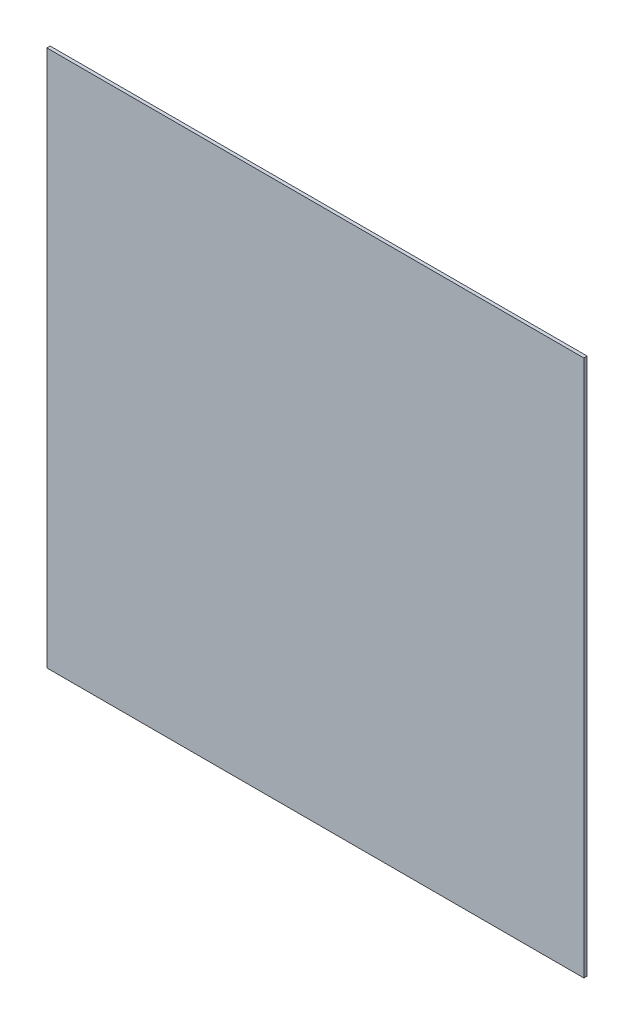
ISO-10303-21;
HEADER;
FILE_DESCRIPTION(('STEP AP214'),'2;1');
FILE_NAME('part.step','',(''),(''),'','','');
FILE_SCHEMA(('AUTOMOTIVE_DESIGN { 1 0 10303 214 1 1 1 1 }'));
ENDSEC;
DATA;
#1=APPLICATION_CONTEXT('core data for automotive mechanical design processes');
#2=APPLICATION_PROTOCOL_DEFINITION('international standard','automotive_design',2000,#1);
#3=PRODUCT_CONTEXT('',#1,'mechanical');
#4=PRODUCT('Part','Part','',(#3));
#5=PRODUCT_RELATED_PRODUCT_CATEGORY('part','',(#4));
#6=PRODUCT_DEFINITION_FORMATION('','',#4);
#7=PRODUCT_DEFINITION_CONTEXT('part definition',#1,'design');
#8=PRODUCT_DEFINITION('design','',#6,#7);
#9=PRODUCT_DEFINITION_SHAPE('','',#8);
#10=(LENGTH_UNIT() NAMED_UNIT(*) SI_UNIT(.MILLI.,.METRE.));
#11=(NAMED_UNIT(*) PLANE_ANGLE_UNIT() SI_UNIT($,.RADIAN.));
#12=(NAMED_UNIT(*) SI_UNIT($,.STERADIAN.) SOLID_ANGLE_UNIT());
#13=UNCERTAINTY_MEASURE_WITH_UNIT(LENGTH_MEASURE(1.E-05),#10,'distance_accuracy_value','');
#14=(GEOMETRIC_REPRESENTATION_CONTEXT(3) GLOBAL_UNCERTAINTY_ASSIGNED_CONTEXT((#13)) GLOBAL_UNIT_ASSIGNED_CONTEXT((#10,
#11,#12)) REPRESENTATION_CONTEXT('',''));
#15=CARTESIAN_POINT('',(0.,0.,0.));
#16=DIRECTION('',(0.,0.,1.));
#17=DIRECTION('',(1.,0.,0.));
#18=AXIS2_PLACEMENT_3D('',#15,#16,#17);
#19=CARTESIAN_POINT('',(50.,6.,0.07366));
#20=DIRECTION('',(1.,0.,0.));
#21=DIRECTION('',(0.,0.,-1.));
#22=AXIS2_PLACEMENT_3D('',#19,#20,#21);
#23=PLANE('',#22);
#24=DIRECTION('',(0.,-1.,0.));
#25=VECTOR('',#24,1.);
#26=CARTESIAN_POINT('',(50.,6.,0.));
#27=LINE('',#26,#25);
#28=CARTESIAN_POINT('',(50.,6.,0.));
#29=VERTEX_POINT('',#28);
#30=CARTESIAN_POINT('',(50.,-6.,0.));
#31=VERTEX_POINT('',#30);
#32=EDGE_CURVE('E114',#29,#31,#27,.T.);
#33=ORIENTED_EDGE('',*,*,#32,.T.);
#34=DIRECTION('',(0.,0.,-1.));
#35=VECTOR('',#34,1.);
#36=CARTESIAN_POINT('',(50.,-6.,0.07366));
#37=LINE('',#36,#35);
#38=CARTESIAN_POINT('',(50.,-6.,0.07366));
#39=VERTEX_POINT('',#38);
#40=EDGE_CURVE('E11',#39,#31,#37,.T.);
#41=ORIENTED_EDGE('',*,*,#40,.F.);
#42=DIRECTION('',(0.,-1.,0.));
#43=VECTOR('',#42,1.);
#44=CARTESIAN_POINT('',(50.,6.,0.07366));
#45=LINE('',#44,#43);
#46=CARTESIAN_POINT('',(50.,6.,0.07366));
#47=VERTEX_POINT('',#46);
#48=EDGE_CURVE('E97',#47,#39,#45,.T.);
#49=ORIENTED_EDGE('',*,*,#48,.F.);
#50=DIRECTION('',(0.,0.,-1.));
#51=VECTOR('',#50,1.);
#52=CARTESIAN_POINT('',(50.,6.,0.07366));
#53=LINE('',#52,#51);
#54=EDGE_CURVE('E110',#47,#29,#53,.T.);
#55=ORIENTED_EDGE('',*,*,#54,.T.);
#56=EDGE_LOOP('',(#33,#41,#49,#55));
#57=FACE_BOUND('',#56,.T.);
#58=ADVANCED_FACE('F45',(#57),#23,.F.);
#59=CARTESIAN_POINT('',(50.,-6.,0.07366));
#60=DIRECTION('',(0.,1.,0.));
#61=DIRECTION('',(0.,0.,1.));
#62=AXIS2_PLACEMENT_3D('',#59,#60,#61);
#63=PLANE('',#62);
#64=DIRECTION('',(1.,0.,0.));
#65=VECTOR('',#64,1.);
#66=CARTESIAN_POINT('',(50.,-6.,0.));
#67=LINE('',#66,#65);
#68=CARTESIAN_POINT('',(62.,-6.,0.));
#69=VERTEX_POINT('',#68);
#70=EDGE_CURVE('E102',#31,#69,#67,.T.);
#71=ORIENTED_EDGE('',*,*,#70,.T.);
#72=DIRECTION('',(0.,0.,-1.));
#73=VECTOR('',#72,1.);
#74=CARTESIAN_POINT('',(62.,-6.,0.07366));
#75=LINE('',#74,#73);
#76=CARTESIAN_POINT('',(62.,-6.,0.07366));
#77=VERTEX_POINT('',#76);
#78=EDGE_CURVE('E54',#77,#69,#75,.T.);
#79=ORIENTED_EDGE('',*,*,#78,.F.);
#80=DIRECTION('',(1.,0.,0.));
#81=VECTOR('',#80,1.);
#82=CARTESIAN_POINT('',(50.,-6.,0.07366));
#83=LINE('',#82,#81);
#84=EDGE_CURVE('E92',#39,#77,#83,.T.);
#85=ORIENTED_EDGE('',*,*,#84,.F.);
#86=ORIENTED_EDGE('',*,*,#40,.T.);
#87=EDGE_LOOP('',(#71,#79,#85,#86));
#88=FACE_BOUND('',#87,.T.);
#89=ADVANCED_FACE('F101',(#88),#63,.F.);
#90=CARTESIAN_POINT('',(62.,6.,0.07366));
#91=DIRECTION('',(-1.,0.,0.));
#92=DIRECTION('',(0.,0.,1.));
#93=AXIS2_PLACEMENT_3D('',#90,#91,#92);
#94=PLANE('',#93);
#95=DIRECTION('',(0.,1.,0.));
#96=VECTOR('',#95,1.);
#97=CARTESIAN_POINT('',(62.,6.,0.));
#98=LINE('',#97,#96);
#99=CARTESIAN_POINT('',(62.,6.,0.));
#100=VERTEX_POINT('',#99);
#101=EDGE_CURVE('E79',#69,#100,#98,.T.);
#102=ORIENTED_EDGE('',*,*,#101,.T.);
#103=DIRECTION('',(0.,0.,-1.));
#104=VECTOR('',#103,1.);
#105=CARTESIAN_POINT('',(62.,6.,0.07366));
#106=LINE('',#105,#104);
#107=CARTESIAN_POINT('',(62.,6.,0.07366));
#108=VERTEX_POINT('',#107);
#109=EDGE_CURVE('E104',#108,#100,#106,.T.);
#110=ORIENTED_EDGE('',*,*,#109,.F.);
#111=DIRECTION('',(0.,1.,0.));
#112=VECTOR('',#111,1.);
#113=CARTESIAN_POINT('',(62.,6.,0.07366));
#114=LINE('',#113,#112);
#115=EDGE_CURVE('E95',#77,#108,#114,.T.);
#116=ORIENTED_EDGE('',*,*,#115,.F.);
#117=ORIENTED_EDGE('',*,*,#78,.T.);
#118=EDGE_LOOP('',(#102,#110,#116,#117));
#119=FACE_BOUND('',#118,.T.);
#120=ADVANCED_FACE('F105',(#119),#94,.F.);
#121=CARTESIAN_POINT('',(50.,6.,0.07366));
#122=DIRECTION('',(0.,-1.,0.));
#123=DIRECTION('',(0.,0.,-1.));
#124=AXIS2_PLACEMENT_3D('',#121,#122,#123);
#125=PLANE('',#124);
#126=DIRECTION('',(-1.,0.,0.));
#127=VECTOR('',#126,1.);
#128=CARTESIAN_POINT('',(50.,6.,0.));
#129=LINE('',#128,#127);
#130=EDGE_CURVE('E85',#100,#29,#129,.T.);
#131=ORIENTED_EDGE('',*,*,#130,.T.);
#132=ORIENTED_EDGE('',*,*,#54,.F.);
#133=DIRECTION('',(-1.,0.,0.));
#134=VECTOR('',#133,1.);
#135=CARTESIAN_POINT('',(50.,6.,0.07366));
#136=LINE('',#135,#134);
#137=EDGE_CURVE('E62',#108,#47,#136,.T.);
#138=ORIENTED_EDGE('',*,*,#137,.F.);
#139=ORIENTED_EDGE('',*,*,#109,.T.);
#140=EDGE_LOOP('',(#131,#132,#138,#139));
#141=FACE_BOUND('',#140,.T.);
#142=ADVANCED_FACE('F128',(#141),#125,.F.);
#143=CARTESIAN_POINT('',(0.,0.,0.07366));
#144=DIRECTION('',(0.,0.,1.));
#145=DIRECTION('',(1.,0.,0.));
#146=AXIS2_PLACEMENT_3D('',#143,#144,#145);
#147=PLANE('',#146);
#148=ORIENTED_EDGE('',*,*,#48,.T.);
#149=ORIENTED_EDGE('',*,*,#84,.T.);
#150=ORIENTED_EDGE('',*,*,#115,.T.);
#151=ORIENTED_EDGE('',*,*,#137,.T.);
#152=EDGE_LOOP('',(#148,#149,#150,#151));
#153=FACE_BOUND('',#152,.T.);
#154=ADVANCED_FACE('F93',(#153),#147,.T.);
#155=CARTESIAN_POINT('',(0.,0.,0.));
#156=DIRECTION('',(0.,0.,1.));
#157=DIRECTION('',(1.,0.,0.));
#158=AXIS2_PLACEMENT_3D('',#155,#156,#157);
#159=PLANE('',#158);
#160=ORIENTED_EDGE('',*,*,#32,.F.);
#161=ORIENTED_EDGE('',*,*,#130,.F.);
#162=ORIENTED_EDGE('',*,*,#101,.F.);
#163=ORIENTED_EDGE('',*,*,#70,.F.);
#164=EDGE_LOOP('',(#160,#161,#162,#163));
#165=FACE_BOUND('',#164,.T.);
#166=ADVANCED_FACE('F131',(#165),#159,.F.);
#167=CLOSED_SHELL('',(#58,#89,#120,#142,#154,#166));
#168=MANIFOLD_SOLID_BREP('B2',#167);
#169=ADVANCED_BREP_SHAPE_REPRESENTATION('',(#18,#168),#14);
#170=SHAPE_DEFINITION_REPRESENTATION(#9,#169);
ENDSEC;
END-ISO-10303-21;
